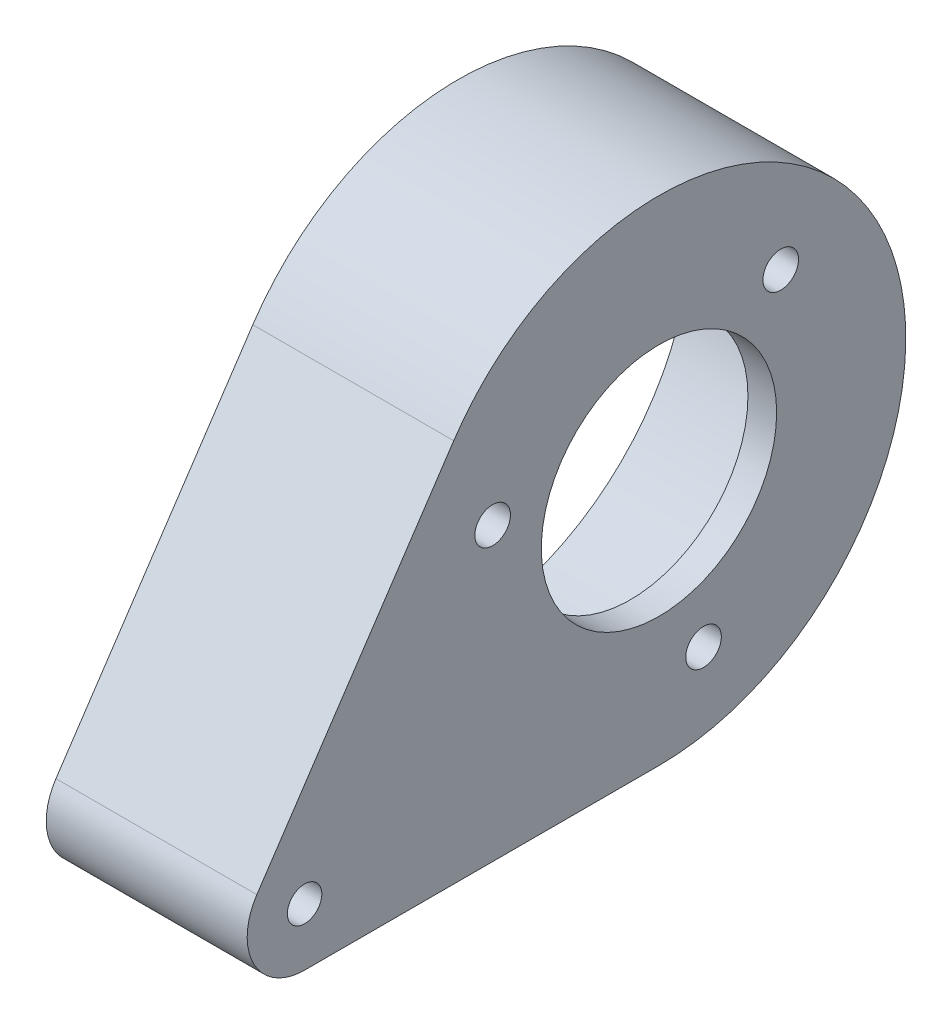
ISO-10303-21;
HEADER;
FILE_DESCRIPTION(('STEP AP214'),'2;1');
FILE_NAME('part.step','',(''),(''),'','','');
FILE_SCHEMA(('AUTOMOTIVE_DESIGN { 1 0 10303 214 1 1 1 1 }'));
ENDSEC;
DATA;
#1=APPLICATION_CONTEXT('core data for automotive mechanical design processes');
#2=APPLICATION_PROTOCOL_DEFINITION('international standard','automotive_design',2000,#1);
#3=PRODUCT_CONTEXT('',#1,'mechanical');
#4=PRODUCT('Part','Part','',(#3));
#5=PRODUCT_RELATED_PRODUCT_CATEGORY('part','',(#4));
#6=PRODUCT_DEFINITION_FORMATION('','',#4);
#7=PRODUCT_DEFINITION_CONTEXT('part definition',#1,'design');
#8=PRODUCT_DEFINITION('design','',#6,#7);
#9=PRODUCT_DEFINITION_SHAPE('','',#8);
#10=(LENGTH_UNIT() NAMED_UNIT(*) SI_UNIT(.MILLI.,.METRE.));
#11=(NAMED_UNIT(*) PLANE_ANGLE_UNIT() SI_UNIT($,.RADIAN.));
#12=(NAMED_UNIT(*) SI_UNIT($,.STERADIAN.) SOLID_ANGLE_UNIT());
#13=UNCERTAINTY_MEASURE_WITH_UNIT(LENGTH_MEASURE(1.E-05),#10,'distance_accuracy_value','');
#14=(GEOMETRIC_REPRESENTATION_CONTEXT(3) GLOBAL_UNCERTAINTY_ASSIGNED_CONTEXT((#13)) GLOBAL_UNIT_ASSIGNED_CONTEXT((#10,
#11,#12)) REPRESENTATION_CONTEXT('',''));
#15=CARTESIAN_POINT('',(0.,0.,0.));
#16=DIRECTION('',(0.,0.,1.));
#17=DIRECTION('',(1.,0.,0.));
#18=AXIS2_PLACEMENT_3D('',#15,#16,#17);
#19=CARTESIAN_POINT('',(2.5,-16.5,30.8666486681013));
#20=DIRECTION('',(-1.,0.,0.));
#21=DIRECTION('',(0.,0.,1.));
#22=AXIS2_PLACEMENT_3D('',#19,#20,#21);
#23=CYLINDRICAL_SURFACE('',#22,5.);
#24=DIRECTION('',(-1.,0.,0.));
#25=VECTOR('',#24,1.);
#26=CARTESIAN_POINT('',(2.5,-13.7224489795918,35.0241972642129));
#27=LINE('',#26,#25);
#28=CARTESIAN_POINT('',(2.5,-13.7224489795918,35.0241972642129));
#29=VERTEX_POINT('',#28);
#30=CARTESIAN_POINT('',(-15.,-13.7224489795918,35.0241972642129));
#31=VERTEX_POINT('',#30);
#32=EDGE_CURVE('E113',#29,#31,#27,.T.);
#33=ORIENTED_EDGE('',*,*,#32,.T.);
#34=CARTESIAN_POINT('',(-15.,-16.5,30.8666486681013));
#35=DIRECTION('',(-1.,0.,0.));
#36=DIRECTION('',(0.,0.,1.));
#37=AXIS2_PLACEMENT_3D('',#34,#35,#36);
#38=CIRCLE('',#37,5.);
#39=CARTESIAN_POINT('',(-15.,-21.5,30.8666486681013));
#40=VERTEX_POINT('',#39);
#41=EDGE_CURVE('E91',#40,#31,#38,.T.);
#42=ORIENTED_EDGE('',*,*,#41,.F.);
#43=DIRECTION('',(-1.,0.,0.));
#44=VECTOR('',#43,1.);
#45=CARTESIAN_POINT('',(2.5,-21.5,30.8666486681013));
#46=LINE('',#45,#44);
#47=CARTESIAN_POINT('',(2.5,-21.5,30.8666486681013));
#48=VERTEX_POINT('',#47);
#49=EDGE_CURVE('E11',#48,#40,#46,.T.);
#50=ORIENTED_EDGE('',*,*,#49,.F.);
#51=CARTESIAN_POINT('',(2.5,-16.5,30.8666486681013));
#52=DIRECTION('',(1.,0.,0.));
#53=DIRECTION('',(0.,0.,-1.));
#54=AXIS2_PLACEMENT_3D('',#51,#52,#53);
#55=CIRCLE('',#54,5.);
#56=EDGE_CURVE('E107',#29,#48,#55,.T.);
#57=ORIENTED_EDGE('',*,*,#56,.F.);
#58=EDGE_LOOP('',(#33,#42,#50,#57));
#59=FACE_BOUND('',#58,.T.);
#60=ADVANCED_FACE('F39',(#59),#23,.T.);
#61=CARTESIAN_POINT('',(2.5,-21.5,30.8666486681013));
#62=DIRECTION('',(0.,1.,0.));
#63=DIRECTION('',(0.,0.,1.));
#64=AXIS2_PLACEMENT_3D('',#61,#62,#63);
#65=PLANE('',#64);
#66=ORIENTED_EDGE('',*,*,#49,.T.);
#67=DIRECTION('',(0.,0.,1.));
#68=VECTOR('',#67,1.);
#69=CARTESIAN_POINT('',(-15.,-21.5,0.));
#70=LINE('',#69,#68);
#71=CARTESIAN_POINT('',(-15.,-21.5,0.));
#72=VERTEX_POINT('',#71);
#73=EDGE_CURVE('E85',#72,#40,#70,.T.);
#74=ORIENTED_EDGE('',*,*,#73,.F.);
#75=DIRECTION('',(-1.,0.,0.));
#76=VECTOR('',#75,1.);
#77=CARTESIAN_POINT('',(2.5,-21.5,0.));
#78=LINE('',#77,#76);
#79=CARTESIAN_POINT('',(2.5,-21.5,0.));
#80=VERTEX_POINT('',#79);
#81=EDGE_CURVE('E46',#80,#72,#78,.T.);
#82=ORIENTED_EDGE('',*,*,#81,.F.);
#83=DIRECTION('',(0.,0.,-1.));
#84=VECTOR('',#83,1.);
#85=CARTESIAN_POINT('',(2.5,-21.5,30.8666486681013));
#86=LINE('',#85,#84);
#87=EDGE_CURVE('E109',#48,#80,#86,.T.);
#88=ORIENTED_EDGE('',*,*,#87,.F.);
#89=EDGE_LOOP('',(#66,#74,#82,#88));
#90=FACE_BOUND('',#89,.T.);
#91=ADVANCED_FACE('F86',(#90),#65,.F.);
#92=CARTESIAN_POINT('',(2.5,0.,0.));
#93=DIRECTION('',(-1.,0.,0.));
#94=DIRECTION('',(0.,0.,1.));
#95=AXIS2_PLACEMENT_3D('',#92,#93,#94);
#96=CYLINDRICAL_SURFACE('',#95,21.5);
#97=ORIENTED_EDGE('',*,*,#81,.T.);
#98=CARTESIAN_POINT('',(-15.,0.,0.));
#99=DIRECTION('',(-1.,0.,0.));
#100=DIRECTION('',(0.,0.,1.));
#101=AXIS2_PLACEMENT_3D('',#98,#99,#100);
#102=CIRCLE('',#101,21.5);
#103=CARTESIAN_POINT('',(-15.,11.9434693877551,17.8774589632799));
#104=VERTEX_POINT('',#103);
#105=EDGE_CURVE('E81',#104,#72,#102,.T.);
#106=ORIENTED_EDGE('',*,*,#105,.F.);
#107=DIRECTION('',(-1.,0.,0.));
#108=VECTOR('',#107,1.);
#109=CARTESIAN_POINT('',(2.5,11.9434693877551,17.8774589632799));
#110=LINE('',#109,#108);
#111=CARTESIAN_POINT('',(2.5,11.9434693877551,17.8774589632799));
#112=VERTEX_POINT('',#111);
#113=EDGE_CURVE('E83',#112,#104,#110,.T.);
#114=ORIENTED_EDGE('',*,*,#113,.F.);
#115=CARTESIAN_POINT('',(2.5,0.,0.));
#116=DIRECTION('',(1.,0.,0.));
#117=DIRECTION('',(0.,0.,-1.));
#118=AXIS2_PLACEMENT_3D('',#115,#116,#117);
#119=CIRCLE('',#118,21.5);
#120=EDGE_CURVE('E58',#80,#112,#119,.T.);
#121=ORIENTED_EDGE('',*,*,#120,.F.);
#122=EDGE_LOOP('',(#97,#106,#114,#121));
#123=FACE_BOUND('',#122,.T.);
#124=ADVANCED_FACE('F79',(#123),#96,.T.);
#125=CARTESIAN_POINT('',(2.5,-13.7224489795918,35.0241972642129));
#126=DIRECTION('',(0.,-0.555510204081633,-0.831509719222321));
#127=DIRECTION('',(0.,0.831509719222321,-0.555510204081633));
#128=AXIS2_PLACEMENT_3D('',#125,#126,#127);
#129=PLANE('',#128);
#130=ORIENTED_EDGE('',*,*,#113,.T.);
#131=DIRECTION('',(0.,0.831509719222321,-0.555510204081633));
#132=VECTOR('',#131,1.);
#133=CARTESIAN_POINT('',(-15.,11.9434693877551,17.8774589632799));
#134=LINE('',#133,#132);
#135=EDGE_CURVE('E97',#31,#104,#134,.T.);
#136=ORIENTED_EDGE('',*,*,#135,.F.);
#137=ORIENTED_EDGE('',*,*,#32,.F.);
#138=DIRECTION('',(0.,-0.831509719222321,0.555510204081633));
#139=VECTOR('',#138,1.);
#140=CARTESIAN_POINT('',(2.5,-13.7224489795918,35.0241972642129));
#141=LINE('',#140,#139);
#142=EDGE_CURVE('E53',#112,#29,#141,.T.);
#143=ORIENTED_EDGE('',*,*,#142,.F.);
#144=EDGE_LOOP('',(#130,#136,#137,#143));
#145=FACE_BOUND('',#144,.T.);
#146=ADVANCED_FACE('F116',(#145),#129,.F.);
#147=CARTESIAN_POINT('',(2.5,-16.5,30.8666486681013));
#148=DIRECTION('',(1.,0.,0.));
#149=DIRECTION('',(0.,0.,-1.));
#150=AXIS2_PLACEMENT_3D('',#147,#148,#149);
#151=PLANE('',#150);
#152=CARTESIAN_POINT('',(2.5,-16.5,30.8666486681013));
#153=DIRECTION('',(-1.,0.,0.));
#154=DIRECTION('',(0.,0.,1.));
#155=AXIS2_PLACEMENT_3D('',#152,#153,#154);
#156=CIRCLE('',#155,1.50000000000001);
#157=CARTESIAN_POINT('',(2.5,-16.5,32.3666486681013));
#158=VERTEX_POINT('',#157);
#159=EDGE_CURVE('E191',#158,#158,#156,.T.);
#160=ORIENTED_EDGE('',*,*,#159,.T.);
#161=EDGE_LOOP('',(#160));
#162=FACE_BOUND('',#161,.T.);
#163=CARTESIAN_POINT('',(2.5,3.88228567653788,14.488887394336));
#164=DIRECTION('',(1.,0.,0.));
#165=DIRECTION('',(0.,0.,-1.));
#166=AXIS2_PLACEMENT_3D('',#163,#164,#165);
#167=CIRCLE('',#166,1.55);
#168=CARTESIAN_POINT('',(2.5,3.88228567653788,12.938887394336));
#169=VERTEX_POINT('',#168);
#170=EDGE_CURVE('E188',#169,#169,#167,.T.);
#171=ORIENTED_EDGE('',*,*,#170,.F.);
#172=EDGE_LOOP('',(#171));
#173=FACE_BOUND('',#172,.T.);
#174=CARTESIAN_POINT('',(2.5,-14.488887394336,-3.88228567653773));
#175=DIRECTION('',(1.,0.,0.));
#176=DIRECTION('',(0.,0.,-1.));
#177=AXIS2_PLACEMENT_3D('',#174,#175,#176);
#178=CIRCLE('',#177,1.55);
#179=CARTESIAN_POINT('',(2.5,-14.488887394336,-5.43228567653774));
#180=VERTEX_POINT('',#179);
#181=EDGE_CURVE('E184',#180,#180,#178,.T.);
#182=ORIENTED_EDGE('',*,*,#181,.F.);
#183=EDGE_LOOP('',(#182));
#184=FACE_BOUND('',#183,.T.);
#185=CARTESIAN_POINT('',(2.5,0.,0.));
#186=DIRECTION('',(1.,0.,0.));
#187=DIRECTION('',(0.,0.,-1.));
#188=AXIS2_PLACEMENT_3D('',#185,#186,#187);
#189=CIRCLE('',#188,10.25);
#190=CARTESIAN_POINT('',(2.5,0.,-10.25));
#191=VERTEX_POINT('',#190);
#192=EDGE_CURVE('E180',#191,#191,#189,.T.);
#193=ORIENTED_EDGE('',*,*,#192,.F.);
#194=EDGE_LOOP('',(#193));
#195=FACE_BOUND('',#194,.T.);
#196=CARTESIAN_POINT('',(2.5,10.6066017177982,-10.6066017177983));
#197=DIRECTION('',(1.,0.,0.));
#198=DIRECTION('',(0.,0.,-1.));
#199=AXIS2_PLACEMENT_3D('',#196,#197,#198);
#200=CIRCLE('',#199,1.55);
#201=CARTESIAN_POINT('',(2.5,10.6066017177982,-12.1566017177983));
#202=VERTEX_POINT('',#201);
#203=EDGE_CURVE('E174',#202,#202,#200,.T.);
#204=ORIENTED_EDGE('',*,*,#203,.F.);
#205=EDGE_LOOP('',(#204));
#206=FACE_BOUND('',#205,.T.);
#207=ORIENTED_EDGE('',*,*,#56,.T.);
#208=ORIENTED_EDGE('',*,*,#87,.T.);
#209=ORIENTED_EDGE('',*,*,#120,.T.);
#210=ORIENTED_EDGE('',*,*,#142,.T.);
#211=EDGE_LOOP('',(#207,#208,#209,#210));
#212=FACE_BOUND('',#211,.T.);
#213=ADVANCED_FACE('F119',(#162,#173,#184,#195,#206,#212),#151,.T.);
#214=CARTESIAN_POINT('',(-15.,0.,0.));
#215=DIRECTION('',(-1.,0.,0.));
#216=DIRECTION('',(0.,0.,1.));
#217=AXIS2_PLACEMENT_3D('',#214,#215,#216);
#218=PLANE('',#217);
#219=CARTESIAN_POINT('',(-15.,-16.5,30.8666486681013));
#220=DIRECTION('',(-1.,0.,0.));
#221=DIRECTION('',(0.,0.,1.));
#222=AXIS2_PLACEMENT_3D('',#219,#220,#221);
#223=CIRCLE('',#222,1.50000000000001);
#224=CARTESIAN_POINT('',(-15.,-16.5,32.3666486681013));
#225=VERTEX_POINT('',#224);
#226=EDGE_CURVE('E192',#225,#225,#223,.T.);
#227=ORIENTED_EDGE('',*,*,#226,.F.);
#228=EDGE_LOOP('',(#227));
#229=FACE_BOUND('',#228,.T.);
#230=ORIENTED_EDGE('',*,*,#105,.T.);
#231=ORIENTED_EDGE('',*,*,#73,.T.);
#232=ORIENTED_EDGE('',*,*,#41,.T.);
#233=ORIENTED_EDGE('',*,*,#135,.T.);
#234=EDGE_LOOP('',(#230,#231,#232,#233));
#235=FACE_BOUND('',#234,.T.);
#236=CARTESIAN_POINT('',(-15.,0.,0.));
#237=DIRECTION('',(-1.,0.,0.));
#238=DIRECTION('',(0.,0.,1.));
#239=AXIS2_PLACEMENT_3D('',#236,#237,#238);
#240=CIRCLE('',#239,20.25);
#241=CARTESIAN_POINT('',(-15.,0.,20.25));
#242=VERTEX_POINT('',#241);
#243=EDGE_CURVE('E98',#242,#242,#240,.T.);
#244=ORIENTED_EDGE('',*,*,#243,.F.);
#245=EDGE_LOOP('',(#244));
#246=FACE_BOUND('',#245,.T.);
#247=ADVANCED_FACE('F94',(#229,#235,#246),#218,.T.);
#248=CARTESIAN_POINT('',(-15.,0.,0.));
#249=DIRECTION('',(1.,0.,0.));
#250=DIRECTION('',(0.,0.,-1.));
#251=AXIS2_PLACEMENT_3D('',#248,#249,#250);
#252=CYLINDRICAL_SURFACE('',#251,20.25);
#253=ORIENTED_EDGE('',*,*,#243,.T.);
#254=EDGE_LOOP('',(#253));
#255=FACE_BOUND('',#254,.T.);
#256=CARTESIAN_POINT('',(0.,0.,0.));
#257=DIRECTION('',(-1.,0.,0.));
#258=DIRECTION('',(0.,0.,1.));
#259=AXIS2_PLACEMENT_3D('',#256,#257,#258);
#260=CIRCLE('',#259,20.25);
#261=CARTESIAN_POINT('',(0.,0.,20.25));
#262=VERTEX_POINT('',#261);
#263=EDGE_CURVE('E101',#262,#262,#260,.T.);
#264=ORIENTED_EDGE('',*,*,#263,.F.);
#265=EDGE_LOOP('',(#264));
#266=FACE_BOUND('',#265,.T.);
#267=ADVANCED_FACE('F127',(#255,#266),#252,.F.);
#268=CARTESIAN_POINT('',(0.,-16.5,30.8666486681013));
#269=DIRECTION('',(1.,0.,0.));
#270=DIRECTION('',(0.,0.,-1.));
#271=AXIS2_PLACEMENT_3D('',#268,#269,#270);
#272=PLANE('',#271);
#273=CARTESIAN_POINT('',(0.,3.88228567653788,14.488887394336));
#274=DIRECTION('',(1.,0.,0.));
#275=DIRECTION('',(0.,0.,-1.));
#276=AXIS2_PLACEMENT_3D('',#273,#274,#275);
#277=CIRCLE('',#276,1.55);
#278=CARTESIAN_POINT('',(0.,3.88228567653788,12.938887394336));
#279=VERTEX_POINT('',#278);
#280=EDGE_CURVE('E158',#279,#279,#277,.F.);
#281=ORIENTED_EDGE('',*,*,#280,.F.);
#282=EDGE_LOOP('',(#281));
#283=FACE_BOUND('',#282,.T.);
#284=CARTESIAN_POINT('',(0.,-14.488887394336,-3.88228567653773));
#285=DIRECTION('',(1.,0.,0.));
#286=DIRECTION('',(0.,0.,-1.));
#287=AXIS2_PLACEMENT_3D('',#284,#285,#286);
#288=CIRCLE('',#287,1.55);
#289=CARTESIAN_POINT('',(0.,-14.488887394336,-5.43228567653774));
#290=VERTEX_POINT('',#289);
#291=EDGE_CURVE('E162',#290,#290,#288,.F.);
#292=ORIENTED_EDGE('',*,*,#291,.F.);
#293=EDGE_LOOP('',(#292));
#294=FACE_BOUND('',#293,.T.);
#295=CARTESIAN_POINT('',(0.,0.,0.));
#296=DIRECTION('',(1.,0.,0.));
#297=DIRECTION('',(0.,0.,-1.));
#298=AXIS2_PLACEMENT_3D('',#295,#296,#297);
#299=CIRCLE('',#298,10.25);
#300=CARTESIAN_POINT('',(0.,0.,-10.25));
#301=VERTEX_POINT('',#300);
#302=EDGE_CURVE('E166',#301,#301,#299,.F.);
#303=ORIENTED_EDGE('',*,*,#302,.F.);
#304=EDGE_LOOP('',(#303));
#305=FACE_BOUND('',#304,.T.);
#306=CARTESIAN_POINT('',(0.,10.6066017177982,-10.6066017177983));
#307=DIRECTION('',(1.,0.,0.));
#308=DIRECTION('',(0.,0.,-1.));
#309=AXIS2_PLACEMENT_3D('',#306,#307,#308);
#310=CIRCLE('',#309,1.55);
#311=CARTESIAN_POINT('',(0.,10.6066017177982,-12.1566017177983));
#312=VERTEX_POINT('',#311);
#313=EDGE_CURVE('E170',#312,#312,#310,.F.);
#314=ORIENTED_EDGE('',*,*,#313,.F.);
#315=EDGE_LOOP('',(#314));
#316=FACE_BOUND('',#315,.T.);
#317=ORIENTED_EDGE('',*,*,#263,.T.);
#318=EDGE_LOOP('',(#317));
#319=FACE_BOUND('',#318,.T.);
#320=ADVANCED_FACE('F142',(#283,#294,#305,#316,#319),#272,.F.);
#321=CARTESIAN_POINT('',(-28.9913780286484,10.6066017177982,-10.6066017177983));
#322=DIRECTION('',(1.,0.,0.));
#323=DIRECTION('',(0.,0.,-1.));
#324=AXIS2_PLACEMENT_3D('',#321,#322,#323);
#325=CYLINDRICAL_SURFACE('',#324,1.55);
#326=ORIENTED_EDGE('',*,*,#313,.T.);
#327=EDGE_LOOP('',(#326));
#328=FACE_BOUND('',#327,.T.);
#329=ORIENTED_EDGE('',*,*,#203,.T.);
#330=EDGE_LOOP('',(#329));
#331=FACE_BOUND('',#330,.T.);
#332=ADVANCED_FACE('F144',(#328,#331),#325,.F.);
#333=CARTESIAN_POINT('',(-28.9913780286484,0.,0.));
#334=DIRECTION('',(1.,0.,0.));
#335=DIRECTION('',(0.,0.,-1.));
#336=AXIS2_PLACEMENT_3D('',#333,#334,#335);
#337=CYLINDRICAL_SURFACE('',#336,10.25);
#338=ORIENTED_EDGE('',*,*,#302,.T.);
#339=EDGE_LOOP('',(#338));
#340=FACE_BOUND('',#339,.T.);
#341=ORIENTED_EDGE('',*,*,#192,.T.);
#342=EDGE_LOOP('',(#341));
#343=FACE_BOUND('',#342,.T.);
#344=ADVANCED_FACE('F150',(#340,#343),#337,.F.);
#345=CARTESIAN_POINT('',(-28.9913780286484,-14.488887394336,-3.88228567653773));
#346=DIRECTION('',(1.,0.,0.));
#347=DIRECTION('',(0.,0.,-1.));
#348=AXIS2_PLACEMENT_3D('',#345,#346,#347);
#349=CYLINDRICAL_SURFACE('',#348,1.55);
#350=ORIENTED_EDGE('',*,*,#291,.T.);
#351=EDGE_LOOP('',(#350));
#352=FACE_BOUND('',#351,.T.);
#353=ORIENTED_EDGE('',*,*,#181,.T.);
#354=EDGE_LOOP('',(#353));
#355=FACE_BOUND('',#354,.T.);
#356=ADVANCED_FACE('F206',(#352,#355),#349,.F.);
#357=CARTESIAN_POINT('',(-28.9913780286484,3.88228567653788,14.488887394336));
#358=DIRECTION('',(1.,0.,0.));
#359=DIRECTION('',(0.,0.,-1.));
#360=AXIS2_PLACEMENT_3D('',#357,#358,#359);
#361=CYLINDRICAL_SURFACE('',#360,1.55);
#362=ORIENTED_EDGE('',*,*,#280,.T.);
#363=EDGE_LOOP('',(#362));
#364=FACE_BOUND('',#363,.T.);
#365=ORIENTED_EDGE('',*,*,#170,.T.);
#366=EDGE_LOOP('',(#365));
#367=FACE_BOUND('',#366,.T.);
#368=ADVANCED_FACE('F200',(#364,#367),#361,.F.);
#369=CARTESIAN_POINT('',(2.5,-16.5,30.8666486681013));
#370=DIRECTION('',(-1.,0.,0.));
#371=DIRECTION('',(0.,0.,1.));
#372=AXIS2_PLACEMENT_3D('',#369,#370,#371);
#373=CYLINDRICAL_SURFACE('',#372,1.50000000000001);
#374=ORIENTED_EDGE('',*,*,#159,.F.);
#375=EDGE_LOOP('',(#374));
#376=FACE_BOUND('',#375,.T.);
#377=ORIENTED_EDGE('',*,*,#226,.T.);
#378=EDGE_LOOP('',(#377));
#379=FACE_BOUND('',#378,.T.);
#380=ADVANCED_FACE('F197',(#376,#379),#373,.F.);
#381=CLOSED_SHELL('',(#60,#91,#124,#146,#213,#247,#267,#320,#332,#344,#356,#368,#380));
#382=MANIFOLD_SOLID_BREP('B2',#381);
#383=ADVANCED_BREP_SHAPE_REPRESENTATION('',(#18,#382),#14);
#384=SHAPE_DEFINITION_REPRESENTATION(#9,#383);
ENDSEC;
END-ISO-10303-21;
